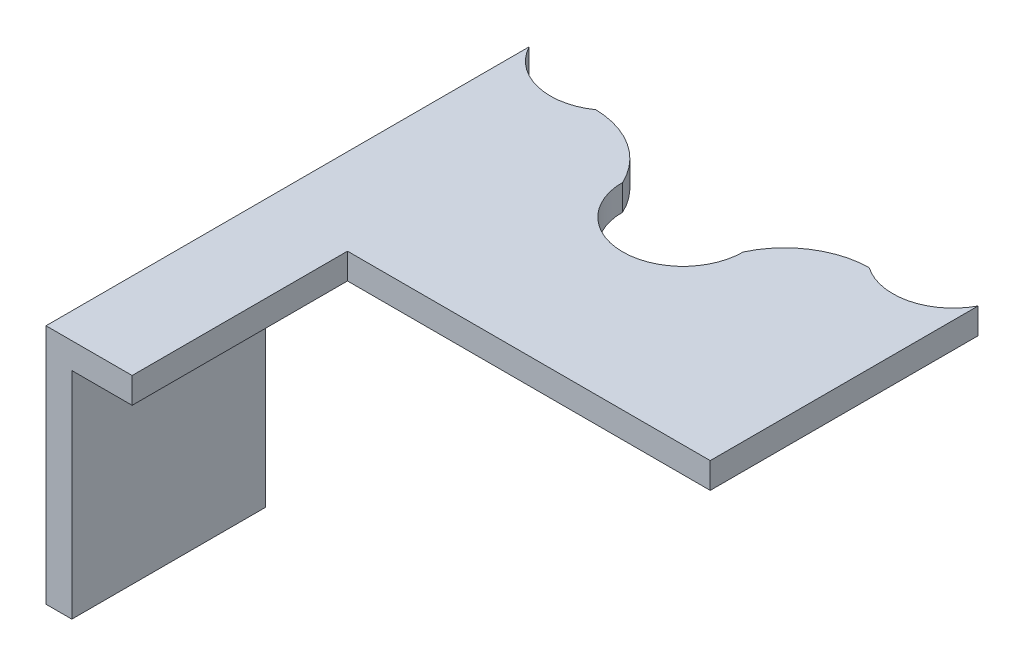
ISO-10303-21;
HEADER;
FILE_DESCRIPTION(('STEP AP214'),'2;1');
FILE_NAME('part.step','',(''),(''),'','','');
FILE_SCHEMA(('AUTOMOTIVE_DESIGN { 1 0 10303 214 1 1 1 1 }'));
ENDSEC;
DATA;
#1=APPLICATION_CONTEXT('core data for automotive mechanical design processes');
#2=APPLICATION_PROTOCOL_DEFINITION('international standard','automotive_design',2000,#1);
#3=PRODUCT_CONTEXT('',#1,'mechanical');
#4=PRODUCT('Part','Part','',(#3));
#5=PRODUCT_RELATED_PRODUCT_CATEGORY('part','',(#4));
#6=PRODUCT_DEFINITION_FORMATION('','',#4);
#7=PRODUCT_DEFINITION_CONTEXT('part definition',#1,'design');
#8=PRODUCT_DEFINITION('design','',#6,#7);
#9=PRODUCT_DEFINITION_SHAPE('','',#8);
#10=(LENGTH_UNIT() NAMED_UNIT(*) SI_UNIT(.MILLI.,.METRE.));
#11=(NAMED_UNIT(*) PLANE_ANGLE_UNIT() SI_UNIT($,.RADIAN.));
#12=(NAMED_UNIT(*) SI_UNIT($,.STERADIAN.) SOLID_ANGLE_UNIT());
#13=UNCERTAINTY_MEASURE_WITH_UNIT(LENGTH_MEASURE(1.E-05),#10,'distance_accuracy_value','');
#14=(GEOMETRIC_REPRESENTATION_CONTEXT(3) GLOBAL_UNCERTAINTY_ASSIGNED_CONTEXT((#13)) GLOBAL_UNIT_ASSIGNED_CONTEXT((#10,
#11,#12)) REPRESENTATION_CONTEXT('',''));
#15=CARTESIAN_POINT('',(0.,0.,0.));
#16=DIRECTION('',(0.,0.,1.));
#17=DIRECTION('',(1.,0.,0.));
#18=AXIS2_PLACEMENT_3D('',#15,#16,#17);
#19=CARTESIAN_POINT('',(16.0451571243017,0.,4.26440295899608));
#20=DIRECTION('',(0.,1.,0.));
#21=DIRECTION('',(0.,0.,1.));
#22=AXIS2_PLACEMENT_3D('',#19,#20,#21);
#23=PLANE('',#22);
#24=DIRECTION('',(0.,0.,1.));
#25=VECTOR('',#24,1.);
#26=CARTESIAN_POINT('',(-23.0555691185354,0.,47.8969535593541));
#27=LINE('',#26,#25);
#28=CARTESIAN_POINT('',(-23.0555691185354,0.,25.3969535593541));
#29=VERTEX_POINT('',#28);
#30=CARTESIAN_POINT('',(-23.0555691185354,0.,47.8969535593541));
#31=VERTEX_POINT('',#30);
#32=EDGE_CURVE('E153',#29,#31,#27,.T.);
#33=ORIENTED_EDGE('',*,*,#32,.F.);
#34=DIRECTION('',(1.,0.,0.));
#35=VECTOR('',#34,1.);
#36=CARTESIAN_POINT('',(-26.0555691185354,0.,25.3969535593541));
#37=LINE('',#36,#35);
#38=CARTESIAN_POINT('',(-26.0555691185354,0.,25.3969535593541));
#39=VERTEX_POINT('',#38);
#40=EDGE_CURVE('E54',#39,#29,#37,.T.);
#41=ORIENTED_EDGE('',*,*,#40,.F.);
#42=DIRECTION('',(0.,0.,1.));
#43=VECTOR('',#42,1.);
#44=CARTESIAN_POINT('',(-26.0555691185354,0.,22.8969535593541));
#45=LINE('',#44,#43);
#46=CARTESIAN_POINT('',(-26.0555691185354,0.,-8.18804644064587));
#47=VERTEX_POINT('',#46);
#48=EDGE_CURVE('E157',#47,#39,#45,.T.);
#49=ORIENTED_EDGE('',*,*,#48,.F.);
#50=CARTESIAN_POINT('',(-19.8752830168529,0.,-11.4749999999999));
#51=DIRECTION('',(0.,-1.,0.));
#52=DIRECTION('',(0.,0.,-1.));
#53=AXIS2_PLACEMENT_3D('',#50,#51,#52);
#54=CIRCLE('',#53,7.);
#55=CARTESIAN_POINT('',(-15.8700792263388,0.,-5.73406431002294));
#56=VERTEX_POINT('',#55);
#57=EDGE_CURVE('E206',#56,#47,#54,.T.);
#58=ORIENTED_EDGE('',*,*,#57,.F.);
#59=CARTESIAN_POINT('',(-16.0451571243017,0.,4.26440295899608));
#60=DIRECTION('',(0.,1.,0.));
#61=DIRECTION('',(0.,0.,1.));
#62=AXIS2_PLACEMENT_3D('',#59,#60,#61);
#63=CIRCLE('',#62,9.99999999999999);
#64=CARTESIAN_POINT('',(-7.,0.,0.));
#65=VERTEX_POINT('',#64);
#66=EDGE_CURVE('E204',#65,#56,#63,.T.);
#67=ORIENTED_EDGE('',*,*,#66,.F.);
#68=CARTESIAN_POINT('',(0.,0.,0.));
#69=DIRECTION('',(0.,-1.,0.));
#70=DIRECTION('',(0.,0.,-1.));
#71=AXIS2_PLACEMENT_3D('',#68,#69,#70);
#72=CIRCLE('',#71,7.);
#73=CARTESIAN_POINT('',(7.,0.,0.));
#74=VERTEX_POINT('',#73);
#75=EDGE_CURVE('E202',#74,#65,#72,.T.);
#76=ORIENTED_EDGE('',*,*,#75,.F.);
#77=CARTESIAN_POINT('',(16.0451571243017,0.,4.26440295899608));
#78=DIRECTION('',(0.,1.,0.));
#79=DIRECTION('',(0.,0.,1.));
#80=AXIS2_PLACEMENT_3D('',#77,#78,#79);
#81=CIRCLE('',#80,10.);
#82=CARTESIAN_POINT('',(15.8700792263388,0.,-5.73406431002295));
#83=VERTEX_POINT('',#82);
#84=EDGE_CURVE('E180',#83,#74,#81,.T.);
#85=ORIENTED_EDGE('',*,*,#84,.F.);
#86=CARTESIAN_POINT('',(19.8752830168529,0.,-11.4749999999999));
#87=DIRECTION('',(0.,-1.,0.));
#88=DIRECTION('',(0.,0.,1.));
#89=AXIS2_PLACEMENT_3D('',#86,#87,#88);
#90=CIRCLE('',#89,7.);
#91=CARTESIAN_POINT('',(26.0555691185354,0.,-8.18804644064582));
#92=VERTEX_POINT('',#91);
#93=EDGE_CURVE('E185',#92,#83,#90,.T.);
#94=ORIENTED_EDGE('',*,*,#93,.F.);
#95=DIRECTION('',(0.,0.,-1.));
#96=VECTOR('',#95,1.);
#97=CARTESIAN_POINT('',(26.0555691185354,0.,-8.18804644064582));
#98=LINE('',#97,#96);
#99=CARTESIAN_POINT('',(26.0555691185354,0.,22.8969535593541));
#100=VERTEX_POINT('',#99);
#101=EDGE_CURVE('E211',#100,#92,#98,.T.);
#102=ORIENTED_EDGE('',*,*,#101,.F.);
#103=DIRECTION('',(1.,0.,0.));
#104=VECTOR('',#103,1.);
#105=CARTESIAN_POINT('',(26.0555691185354,0.,22.8969535593541));
#106=LINE('',#105,#104);
#107=CARTESIAN_POINT('',(-16.0555691185354,0.,22.8969535593541));
#108=VERTEX_POINT('',#107);
#109=EDGE_CURVE('E209',#108,#100,#106,.T.);
#110=ORIENTED_EDGE('',*,*,#109,.F.);
#111=DIRECTION('',(0.,0.,-1.));
#112=VECTOR('',#111,1.);
#113=CARTESIAN_POINT('',(-16.0555691185354,0.,47.8969535593541));
#114=LINE('',#113,#112);
#115=CARTESIAN_POINT('',(-16.0555691185354,0.,47.8969535593541));
#116=VERTEX_POINT('',#115);
#117=EDGE_CURVE('E177',#116,#108,#114,.T.);
#118=ORIENTED_EDGE('',*,*,#117,.F.);
#119=DIRECTION('',(1.,0.,0.));
#120=VECTOR('',#119,1.);
#121=CARTESIAN_POINT('',(-26.0555691185354,0.,47.8969535593541));
#122=LINE('',#121,#120);
#123=EDGE_CURVE('E60',#31,#116,#122,.T.);
#124=ORIENTED_EDGE('',*,*,#123,.F.);
#125=EDGE_LOOP('',(#33,#41,#49,#58,#67,#76,#85,#94,#102,#110,#118,#124));
#126=FACE_BOUND('',#125,.T.);
#127=ADVANCED_FACE('F39',(#126),#23,.F.);
#128=CARTESIAN_POINT('',(26.0555691185354,3.,22.8969535593541));
#129=DIRECTION('',(0.,0.,-1.));
#130=DIRECTION('',(-1.,0.,0.));
#131=AXIS2_PLACEMENT_3D('',#128,#129,#130);
#132=PLANE('',#131);
#133=DIRECTION('',(0.,1.,0.));
#134=VECTOR('',#133,1.);
#135=CARTESIAN_POINT('',(-16.0555691185354,3.,22.8969535593541));
#136=LINE('',#135,#134);
#137=CARTESIAN_POINT('',(-16.0555691185354,3.,22.8969535593541));
#138=VERTEX_POINT('',#137);
#139=EDGE_CURVE('E158',#108,#138,#136,.T.);
#140=ORIENTED_EDGE('',*,*,#139,.F.);
#141=ORIENTED_EDGE('',*,*,#109,.T.);
#142=DIRECTION('',(0.,-1.,0.));
#143=VECTOR('',#142,1.);
#144=CARTESIAN_POINT('',(26.0555691185354,3.,22.8969535593541));
#145=LINE('',#144,#143);
#146=CARTESIAN_POINT('',(26.0555691185354,3.,22.8969535593541));
#147=VERTEX_POINT('',#146);
#148=EDGE_CURVE('E219',#147,#100,#145,.T.);
#149=ORIENTED_EDGE('',*,*,#148,.F.);
#150=DIRECTION('',(1.,0.,0.));
#151=VECTOR('',#150,1.);
#152=CARTESIAN_POINT('',(26.0555691185354,3.,22.8969535593541));
#153=LINE('',#152,#151);
#154=EDGE_CURVE('E193',#138,#147,#153,.T.);
#155=ORIENTED_EDGE('',*,*,#154,.F.);
#156=EDGE_LOOP('',(#140,#141,#149,#155));
#157=FACE_BOUND('',#156,.T.);
#158=ADVANCED_FACE('F261',(#157),#132,.F.);
#159=CARTESIAN_POINT('',(16.0451571243017,3.,4.26440295899608));
#160=DIRECTION('',(0.,-1.,0.));
#161=DIRECTION('',(0.,0.,-1.));
#162=AXIS2_PLACEMENT_3D('',#159,#160,#161);
#163=CYLINDRICAL_SURFACE('',#162,10.);
#164=ORIENTED_EDGE('',*,*,#84,.T.);
#165=DIRECTION('',(0.,-1.,0.));
#166=VECTOR('',#165,1.);
#167=CARTESIAN_POINT('',(7.,3.,0.));
#168=LINE('',#167,#166);
#169=CARTESIAN_POINT('',(7.,3.,0.));
#170=VERTEX_POINT('',#169);
#171=EDGE_CURVE('E11',#170,#74,#168,.T.);
#172=ORIENTED_EDGE('',*,*,#171,.F.);
#173=CARTESIAN_POINT('',(16.0451571243017,3.,4.26440295899608));
#174=DIRECTION('',(0.,1.,0.));
#175=DIRECTION('',(0.,0.,1.));
#176=AXIS2_PLACEMENT_3D('',#173,#174,#175);
#177=CIRCLE('',#176,10.);
#178=CARTESIAN_POINT('',(15.8700792263388,3.,-5.73406431002295));
#179=VERTEX_POINT('',#178);
#180=EDGE_CURVE('E181',#179,#170,#177,.T.);
#181=ORIENTED_EDGE('',*,*,#180,.F.);
#182=DIRECTION('',(0.,-1.,0.));
#183=VECTOR('',#182,1.);
#184=CARTESIAN_POINT('',(15.8700792263388,3.,-5.73406431002295));
#185=LINE('',#184,#183);
#186=EDGE_CURVE('E199',#179,#83,#185,.T.);
#187=ORIENTED_EDGE('',*,*,#186,.T.);
#188=EDGE_LOOP('',(#164,#172,#181,#187));
#189=FACE_BOUND('',#188,.T.);
#190=ADVANCED_FACE('F41',(#189),#163,.T.);
#191=CARTESIAN_POINT('',(0.,3.,0.));
#192=DIRECTION('',(0.,-1.,0.));
#193=DIRECTION('',(0.,0.,-1.));
#194=AXIS2_PLACEMENT_3D('',#191,#192,#193);
#195=CYLINDRICAL_SURFACE('',#194,7.);
#196=ORIENTED_EDGE('',*,*,#75,.T.);
#197=DIRECTION('',(0.,-1.,0.));
#198=VECTOR('',#197,1.);
#199=CARTESIAN_POINT('',(-7.,3.,0.));
#200=LINE('',#199,#198);
#201=CARTESIAN_POINT('',(-7.,3.,0.));
#202=VERTEX_POINT('',#201);
#203=EDGE_CURVE('E47',#202,#65,#200,.T.);
#204=ORIENTED_EDGE('',*,*,#203,.F.);
#205=CARTESIAN_POINT('',(0.,3.,0.));
#206=DIRECTION('',(0.,-1.,0.));
#207=DIRECTION('',(0.,0.,-1.));
#208=AXIS2_PLACEMENT_3D('',#205,#206,#207);
#209=CIRCLE('',#208,7.);
#210=EDGE_CURVE('E184',#170,#202,#209,.T.);
#211=ORIENTED_EDGE('',*,*,#210,.F.);
#212=ORIENTED_EDGE('',*,*,#171,.T.);
#213=EDGE_LOOP('',(#196,#204,#211,#212));
#214=FACE_BOUND('',#213,.T.);
#215=ADVANCED_FACE('F246',(#214),#195,.F.);
#216=CARTESIAN_POINT('',(-16.0451571243017,3.,4.26440295899608));
#217=DIRECTION('',(0.,-1.,0.));
#218=DIRECTION('',(0.,0.,-1.));
#219=AXIS2_PLACEMENT_3D('',#216,#217,#218);
#220=CYLINDRICAL_SURFACE('',#219,9.99999999999999);
#221=ORIENTED_EDGE('',*,*,#66,.T.);
#222=DIRECTION('',(0.,-1.,0.));
#223=VECTOR('',#222,1.);
#224=CARTESIAN_POINT('',(-15.8700792263388,3.,-5.73406431002294));
#225=LINE('',#224,#223);
#226=CARTESIAN_POINT('',(-15.8700792263388,3.,-5.73406431002294));
#227=VERTEX_POINT('',#226);
#228=EDGE_CURVE('E224',#227,#56,#225,.T.);
#229=ORIENTED_EDGE('',*,*,#228,.F.);
#230=CARTESIAN_POINT('',(-16.0451571243017,3.,4.26440295899608));
#231=DIRECTION('',(0.,1.,0.));
#232=DIRECTION('',(0.,0.,1.));
#233=AXIS2_PLACEMENT_3D('',#230,#231,#232);
#234=CIRCLE('',#233,9.99999999999999);
#235=EDGE_CURVE('E187',#202,#227,#234,.T.);
#236=ORIENTED_EDGE('',*,*,#235,.F.);
#237=ORIENTED_EDGE('',*,*,#203,.T.);
#238=EDGE_LOOP('',(#221,#229,#236,#237));
#239=FACE_BOUND('',#238,.T.);
#240=ADVANCED_FACE('F231',(#239),#220,.T.);
#241=CARTESIAN_POINT('',(-19.8752830168529,3.,-11.4749999999999));
#242=DIRECTION('',(0.,-1.,0.));
#243=DIRECTION('',(0.,0.,-1.));
#244=AXIS2_PLACEMENT_3D('',#241,#242,#243);
#245=CYLINDRICAL_SURFACE('',#244,7.);
#246=ORIENTED_EDGE('',*,*,#57,.T.);
#247=DIRECTION('',(0.,-1.,0.));
#248=VECTOR('',#247,1.);
#249=CARTESIAN_POINT('',(-26.0555691185354,3.,-8.18804644064587));
#250=LINE('',#249,#248);
#251=CARTESIAN_POINT('',(-26.0555691185354,3.,-8.18804644064587));
#252=VERTEX_POINT('',#251);
#253=EDGE_CURVE('E222',#252,#47,#250,.T.);
#254=ORIENTED_EDGE('',*,*,#253,.F.);
#255=CARTESIAN_POINT('',(-19.8752830168529,3.,-11.4749999999999));
#256=DIRECTION('',(0.,-1.,0.));
#257=DIRECTION('',(0.,0.,-1.));
#258=AXIS2_PLACEMENT_3D('',#255,#256,#257);
#259=CIRCLE('',#258,7.);
#260=EDGE_CURVE('E189',#227,#252,#259,.T.);
#261=ORIENTED_EDGE('',*,*,#260,.F.);
#262=ORIENTED_EDGE('',*,*,#228,.T.);
#263=EDGE_LOOP('',(#246,#254,#261,#262));
#264=FACE_BOUND('',#263,.T.);
#265=ADVANCED_FACE('F238',(#264),#245,.F.);
#266=CARTESIAN_POINT('',(-26.0555691185354,3.,22.8969535593541));
#267=DIRECTION('',(1.,0.,0.));
#268=DIRECTION('',(0.,0.,-1.));
#269=AXIS2_PLACEMENT_3D('',#266,#267,#268);
#270=PLANE('',#269);
#271=ORIENTED_EDGE('',*,*,#48,.T.);
#272=DIRECTION('',(0.,1.,0.));
#273=VECTOR('',#272,1.);
#274=CARTESIAN_POINT('',(-26.0555691185354,-25.,25.3969535593541));
#275=LINE('',#274,#273);
#276=CARTESIAN_POINT('',(-26.0555691185354,-25.,25.3969535593541));
#277=VERTEX_POINT('',#276);
#278=EDGE_CURVE('E138',#277,#39,#275,.T.);
#279=ORIENTED_EDGE('',*,*,#278,.F.);
#280=DIRECTION('',(0.,0.,-1.));
#281=VECTOR('',#280,1.);
#282=CARTESIAN_POINT('',(-26.0555691185354,-25.,47.8969535593541));
#283=LINE('',#282,#281);
#284=CARTESIAN_POINT('',(-26.0555691185354,-25.,47.8969535593541));
#285=VERTEX_POINT('',#284);
#286=EDGE_CURVE('E144',#285,#277,#283,.T.);
#287=ORIENTED_EDGE('',*,*,#286,.F.);
#288=DIRECTION('',(0.,-1.,0.));
#289=VECTOR('',#288,1.);
#290=CARTESIAN_POINT('',(-26.0555691185354,3.,47.8969535593541));
#291=LINE('',#290,#289);
#292=CARTESIAN_POINT('',(-26.0555691185354,3.,47.8969535593541));
#293=VERTEX_POINT('',#292);
#294=EDGE_CURVE('E169',#293,#285,#291,.T.);
#295=ORIENTED_EDGE('',*,*,#294,.F.);
#296=DIRECTION('',(0.,0.,1.));
#297=VECTOR('',#296,1.);
#298=CARTESIAN_POINT('',(-26.0555691185354,3.,22.8969535593541));
#299=LINE('',#298,#297);
#300=EDGE_CURVE('E191',#252,#293,#299,.T.);
#301=ORIENTED_EDGE('',*,*,#300,.F.);
#302=ORIENTED_EDGE('',*,*,#253,.T.);
#303=EDGE_LOOP('',(#271,#279,#287,#295,#301,#302));
#304=FACE_BOUND('',#303,.T.);
#305=ADVANCED_FACE('F155',(#304),#270,.F.);
#306=CARTESIAN_POINT('',(26.0555691185354,3.,-8.18804644064582));
#307=DIRECTION('',(-1.,0.,0.));
#308=DIRECTION('',(0.,0.,1.));
#309=AXIS2_PLACEMENT_3D('',#306,#307,#308);
#310=PLANE('',#309);
#311=ORIENTED_EDGE('',*,*,#101,.T.);
#312=DIRECTION('',(0.,-1.,0.));
#313=VECTOR('',#312,1.);
#314=CARTESIAN_POINT('',(26.0555691185354,3.,-8.18804644064582));
#315=LINE('',#314,#313);
#316=CARTESIAN_POINT('',(26.0555691185354,3.,-8.18804644064582));
#317=VERTEX_POINT('',#316);
#318=EDGE_CURVE('E216',#317,#92,#315,.T.);
#319=ORIENTED_EDGE('',*,*,#318,.F.);
#320=DIRECTION('',(0.,0.,-1.));
#321=VECTOR('',#320,1.);
#322=CARTESIAN_POINT('',(26.0555691185354,3.,-8.18804644064582));
#323=LINE('',#322,#321);
#324=EDGE_CURVE('E195',#147,#317,#323,.T.);
#325=ORIENTED_EDGE('',*,*,#324,.F.);
#326=ORIENTED_EDGE('',*,*,#148,.T.);
#327=EDGE_LOOP('',(#311,#319,#325,#326));
#328=FACE_BOUND('',#327,.T.);
#329=ADVANCED_FACE('F258',(#328),#310,.F.);
#330=CARTESIAN_POINT('',(19.8752830168529,3.,-11.4749999999999));
#331=DIRECTION('',(0.,-1.,0.));
#332=DIRECTION('',(0.,0.,-1.));
#333=AXIS2_PLACEMENT_3D('',#330,#331,#332);
#334=CYLINDRICAL_SURFACE('',#333,7.);
#335=ORIENTED_EDGE('',*,*,#93,.T.);
#336=ORIENTED_EDGE('',*,*,#186,.F.);
#337=CARTESIAN_POINT('',(19.8752830168529,3.,-11.4749999999999));
#338=DIRECTION('',(0.,-1.,0.));
#339=DIRECTION('',(0.,0.,1.));
#340=AXIS2_PLACEMENT_3D('',#337,#338,#339);
#341=CIRCLE('',#340,7.);
#342=EDGE_CURVE('E197',#317,#179,#341,.T.);
#343=ORIENTED_EDGE('',*,*,#342,.F.);
#344=ORIENTED_EDGE('',*,*,#318,.T.);
#345=EDGE_LOOP('',(#335,#336,#343,#344));
#346=FACE_BOUND('',#345,.T.);
#347=ADVANCED_FACE('F253',(#346),#334,.F.);
#348=CARTESIAN_POINT('',(16.0451571243017,3.,4.26440295899608));
#349=DIRECTION('',(0.,1.,0.));
#350=DIRECTION('',(0.,0.,1.));
#351=AXIS2_PLACEMENT_3D('',#348,#349,#350);
#352=PLANE('',#351);
#353=ORIENTED_EDGE('',*,*,#180,.T.);
#354=ORIENTED_EDGE('',*,*,#210,.T.);
#355=ORIENTED_EDGE('',*,*,#235,.T.);
#356=ORIENTED_EDGE('',*,*,#260,.T.);
#357=ORIENTED_EDGE('',*,*,#300,.T.);
#358=DIRECTION('',(-1.,0.,0.));
#359=VECTOR('',#358,1.);
#360=CARTESIAN_POINT('',(-26.0555691185354,3.,47.8969535593541));
#361=LINE('',#360,#359);
#362=CARTESIAN_POINT('',(-16.0555691185354,3.,47.8969535593541));
#363=VERTEX_POINT('',#362);
#364=EDGE_CURVE('E161',#363,#293,#361,.T.);
#365=ORIENTED_EDGE('',*,*,#364,.F.);
#366=DIRECTION('',(0.,0.,-1.));
#367=VECTOR('',#366,1.);
#368=CARTESIAN_POINT('',(-16.0555691185354,3.,47.8969535593541));
#369=LINE('',#368,#367);
#370=EDGE_CURVE('E173',#363,#138,#369,.T.);
#371=ORIENTED_EDGE('',*,*,#370,.T.);
#372=ORIENTED_EDGE('',*,*,#154,.T.);
#373=ORIENTED_EDGE('',*,*,#324,.T.);
#374=ORIENTED_EDGE('',*,*,#342,.T.);
#375=EDGE_LOOP('',(#353,#354,#355,#356,#357,#365,#371,#372,#373,#374));
#376=FACE_BOUND('',#375,.T.);
#377=ADVANCED_FACE('F243',(#376),#352,.T.);
#378=CARTESIAN_POINT('',(-16.0555691185354,3.,47.8969535593541));
#379=DIRECTION('',(-1.,0.,0.));
#380=DIRECTION('',(0.,0.,1.));
#381=AXIS2_PLACEMENT_3D('',#378,#379,#380);
#382=PLANE('',#381);
#383=ORIENTED_EDGE('',*,*,#139,.T.);
#384=ORIENTED_EDGE('',*,*,#370,.F.);
#385=DIRECTION('',(0.,1.,0.));
#386=VECTOR('',#385,1.);
#387=CARTESIAN_POINT('',(-16.0555691185354,3.,47.8969535593541));
#388=LINE('',#387,#386);
#389=EDGE_CURVE('E172',#116,#363,#388,.T.);
#390=ORIENTED_EDGE('',*,*,#389,.F.);
#391=ORIENTED_EDGE('',*,*,#117,.T.);
#392=EDGE_LOOP('',(#383,#384,#390,#391));
#393=FACE_BOUND('',#392,.T.);
#394=ADVANCED_FACE('F264',(#393),#382,.F.);
#395=CARTESIAN_POINT('',(0.,0.,47.8969535593541));
#396=DIRECTION('',(0.,0.,-1.));
#397=DIRECTION('',(-1.,0.,0.));
#398=AXIS2_PLACEMENT_3D('',#395,#396,#397);
#399=PLANE('',#398);
#400=ORIENTED_EDGE('',*,*,#364,.T.);
#401=ORIENTED_EDGE('',*,*,#294,.T.);
#402=DIRECTION('',(-1.,0.,0.));
#403=VECTOR('',#402,1.);
#404=CARTESIAN_POINT('',(-26.0555691185354,-25.,47.8969535593541));
#405=LINE('',#404,#403);
#406=CARTESIAN_POINT('',(-23.0555691185354,-25.,47.8969535593541));
#407=VERTEX_POINT('',#406);
#408=EDGE_CURVE('E150',#407,#285,#405,.T.);
#409=ORIENTED_EDGE('',*,*,#408,.F.);
#410=DIRECTION('',(0.,1.,0.));
#411=VECTOR('',#410,1.);
#412=CARTESIAN_POINT('',(-23.0555691185354,-25.,47.8969535593541));
#413=LINE('',#412,#411);
#414=EDGE_CURVE('E163',#407,#31,#413,.T.);
#415=ORIENTED_EDGE('',*,*,#414,.T.);
#416=ORIENTED_EDGE('',*,*,#123,.T.);
#417=ORIENTED_EDGE('',*,*,#389,.T.);
#418=EDGE_LOOP('',(#400,#401,#409,#415,#416,#417));
#419=FACE_BOUND('',#418,.T.);
#420=ADVANCED_FACE('F267',(#419),#399,.F.);
#421=CARTESIAN_POINT('',(-26.0555691185354,-25.,25.3969535593541));
#422=DIRECTION('',(0.,0.,1.));
#423=DIRECTION('',(1.,0.,0.));
#424=AXIS2_PLACEMENT_3D('',#421,#422,#423);
#425=PLANE('',#424);
#426=ORIENTED_EDGE('',*,*,#40,.T.);
#427=DIRECTION('',(0.,1.,0.));
#428=VECTOR('',#427,1.);
#429=CARTESIAN_POINT('',(-23.0555691185354,-25.,25.3969535593541));
#430=LINE('',#429,#428);
#431=CARTESIAN_POINT('',(-23.0555691185354,-25.,25.3969535593541));
#432=VERTEX_POINT('',#431);
#433=EDGE_CURVE('E140',#432,#29,#430,.T.);
#434=ORIENTED_EDGE('',*,*,#433,.F.);
#435=DIRECTION('',(1.,0.,0.));
#436=VECTOR('',#435,1.);
#437=CARTESIAN_POINT('',(-26.0555691185354,-25.,25.3969535593541));
#438=LINE('',#437,#436);
#439=EDGE_CURVE('E134',#277,#432,#438,.T.);
#440=ORIENTED_EDGE('',*,*,#439,.F.);
#441=ORIENTED_EDGE('',*,*,#278,.T.);
#442=EDGE_LOOP('',(#426,#434,#440,#441));
#443=FACE_BOUND('',#442,.T.);
#444=ADVANCED_FACE('F136',(#443),#425,.F.);
#445=CARTESIAN_POINT('',(-23.0555691185354,-25.,47.8969535593541));
#446=DIRECTION('',(-1.,0.,0.));
#447=DIRECTION('',(0.,0.,1.));
#448=AXIS2_PLACEMENT_3D('',#445,#446,#447);
#449=PLANE('',#448);
#450=ORIENTED_EDGE('',*,*,#32,.T.);
#451=ORIENTED_EDGE('',*,*,#414,.F.);
#452=DIRECTION('',(0.,0.,1.));
#453=VECTOR('',#452,1.);
#454=CARTESIAN_POINT('',(-23.0555691185354,-25.,47.8969535593541));
#455=LINE('',#454,#453);
#456=EDGE_CURVE('E143',#432,#407,#455,.T.);
#457=ORIENTED_EDGE('',*,*,#456,.F.);
#458=ORIENTED_EDGE('',*,*,#433,.T.);
#459=EDGE_LOOP('',(#450,#451,#457,#458));
#460=FACE_BOUND('',#459,.T.);
#461=ADVANCED_FACE('F275',(#460),#449,.F.);
#462=CARTESIAN_POINT('',(0.,-25.,0.));
#463=DIRECTION('',(0.,-1.,0.));
#464=DIRECTION('',(0.,0.,-1.));
#465=AXIS2_PLACEMENT_3D('',#462,#463,#464);
#466=PLANE('',#465);
#467=ORIENTED_EDGE('',*,*,#286,.T.);
#468=ORIENTED_EDGE('',*,*,#439,.T.);
#469=ORIENTED_EDGE('',*,*,#456,.T.);
#470=ORIENTED_EDGE('',*,*,#408,.T.);
#471=EDGE_LOOP('',(#467,#468,#469,#470));
#472=FACE_BOUND('',#471,.T.);
#473=ADVANCED_FACE('F148',(#472),#466,.T.);
#474=CLOSED_SHELL('',(#127,#158,#190,#215,#240,#265,#305,#329,#347,#377,#394,#420,#444,#461,#473));
#475=MANIFOLD_SOLID_BREP('B2',#474);
#476=ADVANCED_BREP_SHAPE_REPRESENTATION('',(#18,#475),#14);
#477=SHAPE_DEFINITION_REPRESENTATION(#9,#476);
ENDSEC;
END-ISO-10303-21;
